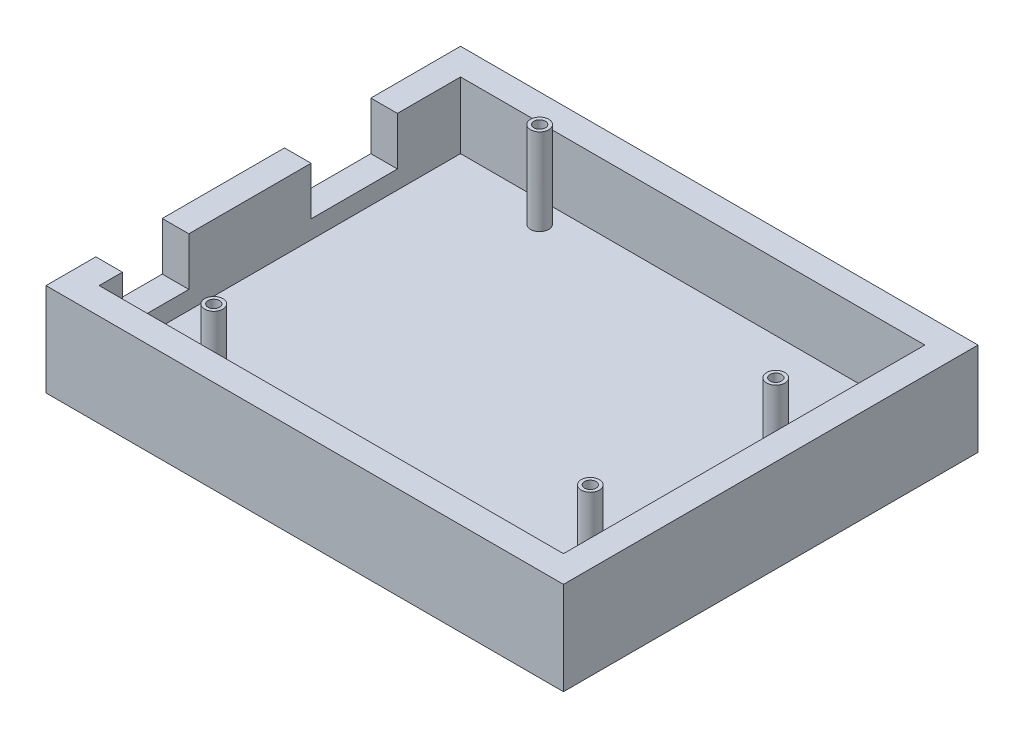
ISO-10303-21;
HEADER;
FILE_DESCRIPTION(('STEP AP214'),'2;1');
FILE_NAME('part.step','',(''),(''),'','','');
FILE_SCHEMA(('AUTOMOTIVE_DESIGN { 1 0 10303 214 1 1 1 1 }'));
ENDSEC;
DATA;
#1=APPLICATION_CONTEXT('core data for automotive mechanical design processes');
#2=APPLICATION_PROTOCOL_DEFINITION('international standard','automotive_design',2000,#1);
#3=PRODUCT_CONTEXT('',#1,'mechanical');
#4=PRODUCT('Part','Part','',(#3));
#5=PRODUCT_RELATED_PRODUCT_CATEGORY('part','',(#4));
#6=PRODUCT_DEFINITION_FORMATION('','',#4);
#7=PRODUCT_DEFINITION_CONTEXT('part definition',#1,'design');
#8=PRODUCT_DEFINITION('design','',#6,#7);
#9=PRODUCT_DEFINITION_SHAPE('','',#8);
#10=(LENGTH_UNIT() NAMED_UNIT(*) SI_UNIT(.MILLI.,.METRE.));
#11=(NAMED_UNIT(*) PLANE_ANGLE_UNIT() SI_UNIT($,.RADIAN.));
#12=(NAMED_UNIT(*) SI_UNIT($,.STERADIAN.) SOLID_ANGLE_UNIT());
#13=UNCERTAINTY_MEASURE_WITH_UNIT(LENGTH_MEASURE(1.E-05),#10,'distance_accuracy_value','');
#14=(GEOMETRIC_REPRESENTATION_CONTEXT(3) GLOBAL_UNCERTAINTY_ASSIGNED_CONTEXT((#13)) GLOBAL_UNIT_ASSIGNED_CONTEXT((#10,
#11,#12)) REPRESENTATION_CONTEXT('',''));
#15=CARTESIAN_POINT('',(0.,0.,0.));
#16=DIRECTION('',(0.,0.,1.));
#17=DIRECTION('',(1.,0.,0.));
#18=AXIS2_PLACEMENT_3D('',#15,#16,#17);
#19=CARTESIAN_POINT('',(0.,10.,0.));
#20=DIRECTION('',(0.,1.,0.));
#21=DIRECTION('',(0.,0.,1.));
#22=AXIS2_PLACEMENT_3D('',#19,#20,#21);
#23=PLANE('',#22);
#24=DIRECTION('',(0.,0.,1.));
#25=VECTOR('',#24,1.);
#26=CARTESIAN_POINT('',(0.,10.,0.));
#27=LINE('',#26,#25);
#28=CARTESIAN_POINT('',(0.,10.,-3.5));
#29=VERTEX_POINT('',#28);
#30=CARTESIAN_POINT('',(0.,10.,0.));
#31=VERTEX_POINT('',#30);
#32=EDGE_CURVE('E179',#29,#31,#27,.T.);
#33=ORIENTED_EDGE('',*,*,#32,.F.);
#34=DIRECTION('',(-1.,0.,0.));
#35=VECTOR('',#34,1.);
#36=CARTESIAN_POINT('',(73.901,10.,-3.5));
#37=LINE('',#36,#35);
#38=CARTESIAN_POINT('',(-4.,10.,-3.5));
#39=VERTEX_POINT('',#38);
#40=EDGE_CURVE('E257',#29,#39,#37,.T.);
#41=ORIENTED_EDGE('',*,*,#40,.T.);
#42=DIRECTION('',(0.,0.,1.));
#43=VECTOR('',#42,1.);
#44=CARTESIAN_POINT('',(-4.,10.,4.));
#45=LINE('',#44,#43);
#46=CARTESIAN_POINT('',(-4.,10.,4.));
#47=VERTEX_POINT('',#46);
#48=EDGE_CURVE('E221',#39,#47,#45,.T.);
#49=ORIENTED_EDGE('',*,*,#48,.T.);
#50=DIRECTION('',(1.,0.,0.));
#51=VECTOR('',#50,1.);
#52=CARTESIAN_POINT('',(-4.,10.,4.));
#53=LINE('',#52,#51);
#54=CARTESIAN_POINT('',(73.9,10.,4.));
#55=VERTEX_POINT('',#54);
#56=EDGE_CURVE('E214',#47,#55,#53,.T.);
#57=ORIENTED_EDGE('',*,*,#56,.T.);
#58=DIRECTION('',(0.,0.,-1.));
#59=VECTOR('',#58,1.);
#60=CARTESIAN_POINT('',(73.9,10.,4.));
#61=LINE('',#60,#59);
#62=CARTESIAN_POINT('',(73.9,10.,-58.4));
#63=VERTEX_POINT('',#62);
#64=EDGE_CURVE('E217',#55,#63,#61,.T.);
#65=ORIENTED_EDGE('',*,*,#64,.T.);
#66=DIRECTION('',(-1.,0.,0.));
#67=VECTOR('',#66,1.);
#68=CARTESIAN_POINT('',(-4.,10.,-58.4));
#69=LINE('',#68,#67);
#70=CARTESIAN_POINT('',(-4.,10.,-58.4));
#71=VERTEX_POINT('',#70);
#72=EDGE_CURVE('E219',#63,#71,#69,.T.);
#73=ORIENTED_EDGE('',*,*,#72,.T.);
#74=CARTESIAN_POINT('',(-4.,10.,-44.9));
#75=VERTEX_POINT('',#74);
#76=EDGE_CURVE('E222',#71,#75,#45,.T.);
#77=ORIENTED_EDGE('',*,*,#76,.T.);
#78=DIRECTION('',(-1.,0.,0.));
#79=VECTOR('',#78,1.);
#80=CARTESIAN_POINT('',(73.901,10.,-44.9));
#81=LINE('',#80,#79);
#82=CARTESIAN_POINT('',(0.,10.,-44.9));
#83=VERTEX_POINT('',#82);
#84=EDGE_CURVE('E265',#83,#75,#81,.T.);
#85=ORIENTED_EDGE('',*,*,#84,.F.);
#86=CARTESIAN_POINT('',(0.,10.,-54.4));
#87=VERTEX_POINT('',#86);
#88=EDGE_CURVE('E178',#87,#83,#27,.T.);
#89=ORIENTED_EDGE('',*,*,#88,.F.);
#90=DIRECTION('',(-1.,0.,0.));
#91=VECTOR('',#90,1.);
#92=CARTESIAN_POINT('',(0.,10.,-54.4));
#93=LINE('',#92,#91);
#94=CARTESIAN_POINT('',(69.9,10.,-54.4));
#95=VERTEX_POINT('',#94);
#96=EDGE_CURVE('E192',#95,#87,#93,.T.);
#97=ORIENTED_EDGE('',*,*,#96,.F.);
#98=DIRECTION('',(0.,0.,-1.));
#99=VECTOR('',#98,1.);
#100=CARTESIAN_POINT('',(69.9,10.,0.));
#101=LINE('',#100,#99);
#102=CARTESIAN_POINT('',(69.9,10.,0.));
#103=VERTEX_POINT('',#102);
#104=EDGE_CURVE('E189',#103,#95,#101,.T.);
#105=ORIENTED_EDGE('',*,*,#104,.F.);
#106=DIRECTION('',(1.,0.,0.));
#107=VECTOR('',#106,1.);
#108=CARTESIAN_POINT('',(0.,10.,0.));
#109=LINE('',#108,#107);
#110=EDGE_CURVE('E182',#31,#103,#109,.T.);
#111=ORIENTED_EDGE('',*,*,#110,.F.);
#112=EDGE_LOOP('',(#33,#41,#49,#57,#65,#73,#77,#85,#89,#97,#105,#111));
#113=FACE_BOUND('',#112,.T.);
#114=ADVANCED_FACE('F41',(#113),#23,.T.);
#115=CARTESIAN_POINT('',(-4.,10.,-31.9));
#116=VERTEX_POINT('',#115);
#117=CARTESIAN_POINT('',(-4.,10.,-13.5));
#118=VERTEX_POINT('',#117);
#119=EDGE_CURVE('E171',#116,#118,#45,.T.);
#120=ORIENTED_EDGE('',*,*,#119,.T.);
#121=DIRECTION('',(-1.,0.,0.));
#122=VECTOR('',#121,1.);
#123=CARTESIAN_POINT('',(73.901,10.,-13.5));
#124=LINE('',#123,#122);
#125=CARTESIAN_POINT('',(0.,10.,-13.5));
#126=VERTEX_POINT('',#125);
#127=EDGE_CURVE('E157',#126,#118,#124,.T.);
#128=ORIENTED_EDGE('',*,*,#127,.F.);
#129=CARTESIAN_POINT('',(0.,10.,-31.9));
#130=VERTEX_POINT('',#129);
#131=EDGE_CURVE('E169',#130,#126,#27,.T.);
#132=ORIENTED_EDGE('',*,*,#131,.F.);
#133=DIRECTION('',(-1.,0.,0.));
#134=VECTOR('',#133,1.);
#135=CARTESIAN_POINT('',(73.901,10.,-31.9));
#136=LINE('',#135,#134);
#137=EDGE_CURVE('E66',#130,#116,#136,.T.);
#138=ORIENTED_EDGE('',*,*,#137,.T.);
#139=EDGE_LOOP('',(#120,#128,#132,#138));
#140=FACE_BOUND('',#139,.T.);
#141=ADVANCED_FACE('F168',(#140),#23,.T.);
#142=CARTESIAN_POINT('',(-4.,10.,4.));
#143=DIRECTION('',(1.,0.,0.));
#144=DIRECTION('',(0.,0.,-1.));
#145=AXIS2_PLACEMENT_3D('',#142,#143,#144);
#146=PLANE('',#145);
#147=DIRECTION('',(0.,-1.,0.));
#148=VECTOR('',#147,1.);
#149=CARTESIAN_POINT('',(-4.,0.,-3.5));
#150=LINE('',#149,#148);
#151=CARTESIAN_POINT('',(-4.,2.75000000000003,-3.5));
#152=VERTEX_POINT('',#151);
#153=EDGE_CURVE('E254',#39,#152,#150,.T.);
#154=ORIENTED_EDGE('',*,*,#153,.T.);
#155=DIRECTION('',(0.,0.,-1.));
#156=VECTOR('',#155,1.);
#157=CARTESIAN_POINT('',(-4.,2.75000000000003,0.));
#158=LINE('',#157,#156);
#159=CARTESIAN_POINT('',(-4.,2.75000000000003,-13.5));
#160=VERTEX_POINT('',#159);
#161=EDGE_CURVE('E249',#152,#160,#158,.T.);
#162=ORIENTED_EDGE('',*,*,#161,.T.);
#163=DIRECTION('',(0.,1.,0.));
#164=VECTOR('',#163,1.);
#165=CARTESIAN_POINT('',(-4.,0.,-13.5));
#166=LINE('',#165,#164);
#167=EDGE_CURVE('E173',#160,#118,#166,.T.);
#168=ORIENTED_EDGE('',*,*,#167,.T.);
#169=ORIENTED_EDGE('',*,*,#119,.F.);
#170=DIRECTION('',(0.,1.,0.));
#171=VECTOR('',#170,1.);
#172=CARTESIAN_POINT('',(-4.,2.75000000000003,-31.9));
#173=LINE('',#172,#171);
#174=CARTESIAN_POINT('',(-4.,2.75000000000003,-31.9));
#175=VERTEX_POINT('',#174);
#176=EDGE_CURVE('E270',#175,#116,#173,.T.);
#177=ORIENTED_EDGE('',*,*,#176,.F.);
#178=DIRECTION('',(0.,0.,1.));
#179=VECTOR('',#178,1.);
#180=CARTESIAN_POINT('',(-4.,2.75000000000003,-44.9));
#181=LINE('',#180,#179);
#182=CARTESIAN_POINT('',(-4.,2.75000000000003,-44.9));
#183=VERTEX_POINT('',#182);
#184=EDGE_CURVE('E272',#183,#175,#181,.T.);
#185=ORIENTED_EDGE('',*,*,#184,.F.);
#186=DIRECTION('',(0.,-1.,0.));
#187=VECTOR('',#186,1.);
#188=CARTESIAN_POINT('',(-4.,2.75000000000003,-44.9));
#189=LINE('',#188,#187);
#190=EDGE_CURVE('E266',#75,#183,#189,.T.);
#191=ORIENTED_EDGE('',*,*,#190,.F.);
#192=ORIENTED_EDGE('',*,*,#76,.F.);
#193=DIRECTION('',(0.,-1.,0.));
#194=VECTOR('',#193,1.);
#195=CARTESIAN_POINT('',(-4.,10.,-58.4));
#196=LINE('',#195,#194);
#197=CARTESIAN_POINT('',(-4.,-3.99999999999997,-58.4));
#198=VERTEX_POINT('',#197);
#199=EDGE_CURVE('E227',#71,#198,#196,.T.);
#200=ORIENTED_EDGE('',*,*,#199,.T.);
#201=DIRECTION('',(0.,0.,1.));
#202=VECTOR('',#201,1.);
#203=CARTESIAN_POINT('',(-4.,-3.99999999999997,-58.4));
#204=LINE('',#203,#202);
#205=CARTESIAN_POINT('',(-4.,-3.99999999999997,4.));
#206=VERTEX_POINT('',#205);
#207=EDGE_CURVE('E286',#198,#206,#204,.T.);
#208=ORIENTED_EDGE('',*,*,#207,.T.);
#209=DIRECTION('',(0.,-1.,0.));
#210=VECTOR('',#209,1.);
#211=CARTESIAN_POINT('',(-4.,10.,4.));
#212=LINE('',#211,#210);
#213=EDGE_CURVE('E225',#47,#206,#212,.T.);
#214=ORIENTED_EDGE('',*,*,#213,.F.);
#215=ORIENTED_EDGE('',*,*,#48,.F.);
#216=EDGE_LOOP('',(#154,#162,#168,#169,#177,#185,#191,#192,#200,#208,#214,#215));
#217=FACE_BOUND('',#216,.T.);
#218=ADVANCED_FACE('F301',(#217),#146,.F.);
#219=CARTESIAN_POINT('',(0.,10.,0.));
#220=DIRECTION('',(1.,0.,0.));
#221=DIRECTION('',(0.,0.,-1.));
#222=AXIS2_PLACEMENT_3D('',#219,#220,#221);
#223=PLANE('',#222);
#224=DIRECTION('',(0.,0.,-1.));
#225=VECTOR('',#224,1.);
#226=CARTESIAN_POINT('',(0.,2.75000000000003,0.));
#227=LINE('',#226,#225);
#228=CARTESIAN_POINT('',(0.,2.75000000000003,-3.5));
#229=VERTEX_POINT('',#228);
#230=CARTESIAN_POINT('',(0.,2.75000000000003,-13.5));
#231=VERTEX_POINT('',#230);
#232=EDGE_CURVE('E163',#229,#231,#227,.T.);
#233=ORIENTED_EDGE('',*,*,#232,.F.);
#234=DIRECTION('',(0.,-1.,0.));
#235=VECTOR('',#234,1.);
#236=CARTESIAN_POINT('',(0.,0.,-3.5));
#237=LINE('',#236,#235);
#238=EDGE_CURVE('E172',#29,#229,#237,.T.);
#239=ORIENTED_EDGE('',*,*,#238,.F.);
#240=ORIENTED_EDGE('',*,*,#32,.T.);
#241=DIRECTION('',(0.,-1.,0.));
#242=VECTOR('',#241,1.);
#243=CARTESIAN_POINT('',(0.,10.,0.));
#244=LINE('',#243,#242);
#245=CARTESIAN_POINT('',(0.,0.,0.));
#246=VERTEX_POINT('',#245);
#247=EDGE_CURVE('E211',#31,#246,#244,.T.);
#248=ORIENTED_EDGE('',*,*,#247,.T.);
#249=DIRECTION('',(0.,0.,1.));
#250=VECTOR('',#249,1.);
#251=CARTESIAN_POINT('',(0.,0.,0.));
#252=LINE('',#251,#250);
#253=CARTESIAN_POINT('',(0.,0.,-54.4));
#254=VERTEX_POINT('',#253);
#255=EDGE_CURVE('E195',#254,#246,#252,.T.);
#256=ORIENTED_EDGE('',*,*,#255,.F.);
#257=DIRECTION('',(0.,-1.,0.));
#258=VECTOR('',#257,1.);
#259=CARTESIAN_POINT('',(0.,10.,-54.4));
#260=LINE('',#259,#258);
#261=EDGE_CURVE('E194',#87,#254,#260,.T.);
#262=ORIENTED_EDGE('',*,*,#261,.F.);
#263=ORIENTED_EDGE('',*,*,#88,.T.);
#264=DIRECTION('',(0.,-1.,0.));
#265=VECTOR('',#264,1.);
#266=CARTESIAN_POINT('',(0.,2.75000000000003,-44.9));
#267=LINE('',#266,#265);
#268=CARTESIAN_POINT('',(0.,2.75000000000003,-44.9));
#269=VERTEX_POINT('',#268);
#270=EDGE_CURVE('E275',#83,#269,#267,.T.);
#271=ORIENTED_EDGE('',*,*,#270,.T.);
#272=DIRECTION('',(0.,0.,1.));
#273=VECTOR('',#272,1.);
#274=CARTESIAN_POINT('',(0.,2.75000000000003,-44.9));
#275=LINE('',#274,#273);
#276=CARTESIAN_POINT('',(0.,2.75000000000003,-31.9));
#277=VERTEX_POINT('',#276);
#278=EDGE_CURVE('E162',#269,#277,#275,.T.);
#279=ORIENTED_EDGE('',*,*,#278,.T.);
#280=DIRECTION('',(0.,1.,0.));
#281=VECTOR('',#280,1.);
#282=CARTESIAN_POINT('',(0.,2.75000000000003,-31.9));
#283=LINE('',#282,#281);
#284=EDGE_CURVE('E177',#277,#130,#283,.T.);
#285=ORIENTED_EDGE('',*,*,#284,.T.);
#286=ORIENTED_EDGE('',*,*,#131,.T.);
#287=DIRECTION('',(0.,1.,0.));
#288=VECTOR('',#287,1.);
#289=CARTESIAN_POINT('',(0.,0.,-13.5));
#290=LINE('',#289,#288);
#291=EDGE_CURVE('E154',#231,#126,#290,.T.);
#292=ORIENTED_EDGE('',*,*,#291,.F.);
#293=EDGE_LOOP('',(#233,#239,#240,#248,#256,#262,#263,#271,#279,#285,#286,#292));
#294=FACE_BOUND('',#293,.T.);
#295=ADVANCED_FACE('F175',(#294),#223,.T.);
#296=CARTESIAN_POINT('',(-4.,10.,4.));
#297=DIRECTION('',(0.,0.,-1.));
#298=DIRECTION('',(-1.,0.,0.));
#299=AXIS2_PLACEMENT_3D('',#296,#297,#298);
#300=PLANE('',#299);
#301=ORIENTED_EDGE('',*,*,#213,.T.);
#302=DIRECTION('',(1.,0.,0.));
#303=VECTOR('',#302,1.);
#304=CARTESIAN_POINT('',(-4.,-3.99999999999997,4.));
#305=LINE('',#304,#303);
#306=CARTESIAN_POINT('',(73.9,-3.99999999999997,4.));
#307=VERTEX_POINT('',#306);
#308=EDGE_CURVE('E288',#206,#307,#305,.T.);
#309=ORIENTED_EDGE('',*,*,#308,.T.);
#310=DIRECTION('',(0.,-1.,0.));
#311=VECTOR('',#310,1.);
#312=CARTESIAN_POINT('',(73.9,10.,4.));
#313=LINE('',#312,#311);
#314=EDGE_CURVE('E45',#55,#307,#313,.T.);
#315=ORIENTED_EDGE('',*,*,#314,.F.);
#316=ORIENTED_EDGE('',*,*,#56,.F.);
#317=EDGE_LOOP('',(#301,#309,#315,#316));
#318=FACE_BOUND('',#317,.T.);
#319=ADVANCED_FACE('F43',(#318),#300,.F.);
#320=CARTESIAN_POINT('',(73.9,10.,4.));
#321=DIRECTION('',(-1.,0.,0.));
#322=DIRECTION('',(0.,0.,1.));
#323=AXIS2_PLACEMENT_3D('',#320,#321,#322);
#324=PLANE('',#323);
#325=ORIENTED_EDGE('',*,*,#314,.T.);
#326=DIRECTION('',(0.,0.,-1.));
#327=VECTOR('',#326,1.);
#328=CARTESIAN_POINT('',(73.9,-3.99999999999997,4.));
#329=LINE('',#328,#327);
#330=CARTESIAN_POINT('',(73.9,-3.99999999999997,-58.4));
#331=VERTEX_POINT('',#330);
#332=EDGE_CURVE('E186',#307,#331,#329,.T.);
#333=ORIENTED_EDGE('',*,*,#332,.T.);
#334=DIRECTION('',(0.,-1.,0.));
#335=VECTOR('',#334,1.);
#336=CARTESIAN_POINT('',(73.9,10.,-58.4));
#337=LINE('',#336,#335);
#338=EDGE_CURVE('E228',#63,#331,#337,.T.);
#339=ORIENTED_EDGE('',*,*,#338,.F.);
#340=ORIENTED_EDGE('',*,*,#64,.F.);
#341=EDGE_LOOP('',(#325,#333,#339,#340));
#342=FACE_BOUND('',#341,.T.);
#343=ADVANCED_FACE('F292',(#342),#324,.F.);
#344=CARTESIAN_POINT('',(-4.,10.,-58.4));
#345=DIRECTION('',(0.,0.,1.));
#346=DIRECTION('',(1.,0.,0.));
#347=AXIS2_PLACEMENT_3D('',#344,#345,#346);
#348=PLANE('',#347);
#349=ORIENTED_EDGE('',*,*,#338,.T.);
#350=DIRECTION('',(-1.,0.,0.));
#351=VECTOR('',#350,1.);
#352=CARTESIAN_POINT('',(73.9,-3.99999999999997,-58.4));
#353=LINE('',#352,#351);
#354=EDGE_CURVE('E269',#331,#198,#353,.T.);
#355=ORIENTED_EDGE('',*,*,#354,.T.);
#356=ORIENTED_EDGE('',*,*,#199,.F.);
#357=ORIENTED_EDGE('',*,*,#72,.F.);
#358=EDGE_LOOP('',(#349,#355,#356,#357));
#359=FACE_BOUND('',#358,.T.);
#360=ADVANCED_FACE('F297',(#359),#348,.F.);
#361=CARTESIAN_POINT('',(0.,10.,0.));
#362=DIRECTION('',(0.,0.,-1.));
#363=DIRECTION('',(-1.,0.,0.));
#364=AXIS2_PLACEMENT_3D('',#361,#362,#363);
#365=PLANE('',#364);
#366=DIRECTION('',(1.,0.,0.));
#367=VECTOR('',#366,1.);
#368=CARTESIAN_POINT('',(0.,0.,0.));
#369=LINE('',#368,#367);
#370=CARTESIAN_POINT('',(69.9,0.,0.));
#371=VERTEX_POINT('',#370);
#372=EDGE_CURVE('E198',#246,#371,#369,.T.);
#373=ORIENTED_EDGE('',*,*,#372,.F.);
#374=ORIENTED_EDGE('',*,*,#247,.F.);
#375=ORIENTED_EDGE('',*,*,#110,.T.);
#376=DIRECTION('',(0.,-1.,0.));
#377=VECTOR('',#376,1.);
#378=CARTESIAN_POINT('',(69.9,10.,0.));
#379=LINE('',#378,#377);
#380=EDGE_CURVE('E209',#103,#371,#379,.T.);
#381=ORIENTED_EDGE('',*,*,#380,.T.);
#382=EDGE_LOOP('',(#373,#374,#375,#381));
#383=FACE_BOUND('',#382,.T.);
#384=ADVANCED_FACE('F327',(#383),#365,.T.);
#385=CARTESIAN_POINT('',(69.9,10.,0.));
#386=DIRECTION('',(-1.,0.,0.));
#387=DIRECTION('',(0.,0.,1.));
#388=AXIS2_PLACEMENT_3D('',#385,#386,#387);
#389=PLANE('',#388);
#390=DIRECTION('',(0.,0.,-1.));
#391=VECTOR('',#390,1.);
#392=CARTESIAN_POINT('',(69.9,0.,0.));
#393=LINE('',#392,#391);
#394=CARTESIAN_POINT('',(69.9,0.,-54.4));
#395=VERTEX_POINT('',#394);
#396=EDGE_CURVE('E201',#371,#395,#393,.T.);
#397=ORIENTED_EDGE('',*,*,#396,.F.);
#398=ORIENTED_EDGE('',*,*,#380,.F.);
#399=ORIENTED_EDGE('',*,*,#104,.T.);
#400=DIRECTION('',(0.,-1.,0.));
#401=VECTOR('',#400,1.);
#402=CARTESIAN_POINT('',(69.9,10.,-54.4));
#403=LINE('',#402,#401);
#404=EDGE_CURVE('E207',#95,#395,#403,.T.);
#405=ORIENTED_EDGE('',*,*,#404,.T.);
#406=EDGE_LOOP('',(#397,#398,#399,#405));
#407=FACE_BOUND('',#406,.T.);
#408=ADVANCED_FACE('F331',(#407),#389,.T.);
#409=CARTESIAN_POINT('',(0.,10.,-54.4));
#410=DIRECTION('',(0.,0.,1.));
#411=DIRECTION('',(1.,0.,0.));
#412=AXIS2_PLACEMENT_3D('',#409,#410,#411);
#413=PLANE('',#412);
#414=DIRECTION('',(-1.,0.,0.));
#415=VECTOR('',#414,1.);
#416=CARTESIAN_POINT('',(0.,0.,-54.4));
#417=LINE('',#416,#415);
#418=EDGE_CURVE('E183',#395,#254,#417,.T.);
#419=ORIENTED_EDGE('',*,*,#418,.F.);
#420=ORIENTED_EDGE('',*,*,#404,.F.);
#421=ORIENTED_EDGE('',*,*,#96,.T.);
#422=ORIENTED_EDGE('',*,*,#261,.T.);
#423=EDGE_LOOP('',(#419,#420,#421,#422));
#424=FACE_BOUND('',#423,.T.);
#425=ADVANCED_FACE('F336',(#424),#413,.T.);
#426=CARTESIAN_POINT('',(0.,0.,0.));
#427=DIRECTION('',(0.,1.,0.));
#428=DIRECTION('',(0.,0.,1.));
#429=AXIS2_PLACEMENT_3D('',#426,#427,#428);
#430=PLANE('',#429);
#431=CARTESIAN_POINT('',(14.01445,0.,-3.24144999999999));
#432=DIRECTION('',(0.,1.,0.));
#433=DIRECTION('',(0.,0.,1.));
#434=AXIS2_PLACEMENT_3D('',#431,#432,#433);
#435=CIRCLE('',#434,1.36925);
#436=CARTESIAN_POINT('',(14.01445,0.,-1.87219999999999));
#437=VERTEX_POINT('',#436);
#438=EDGE_CURVE('E11',#437,#437,#435,.T.);
#439=ORIENTED_EDGE('',*,*,#438,.F.);
#440=EDGE_LOOP('',(#439));
#441=FACE_BOUND('',#440,.T.);
#442=CARTESIAN_POINT('',(65.94475,0.,-35.91855));
#443=DIRECTION('',(0.,1.,0.));
#444=DIRECTION('',(0.,0.,1.));
#445=AXIS2_PLACEMENT_3D('',#442,#443,#444);
#446=CIRCLE('',#445,1.36925);
#447=CARTESIAN_POINT('',(65.94475,0.,-34.5493));
#448=VERTEX_POINT('',#447);
#449=EDGE_CURVE('E50',#448,#448,#446,.T.);
#450=ORIENTED_EDGE('',*,*,#449,.F.);
#451=EDGE_LOOP('',(#450));
#452=FACE_BOUND('',#451,.T.);
#453=CARTESIAN_POINT('',(15.15745,0.,-51.15855));
#454=DIRECTION('',(0.,1.,0.));
#455=DIRECTION('',(0.,0.,1.));
#456=AXIS2_PLACEMENT_3D('',#453,#454,#455);
#457=CIRCLE('',#456,1.36924999999999);
#458=CARTESIAN_POINT('',(15.15745,0.,-49.7893));
#459=VERTEX_POINT('',#458);
#460=EDGE_CURVE('E240',#459,#459,#457,.T.);
#461=ORIENTED_EDGE('',*,*,#460,.F.);
#462=EDGE_LOOP('',(#461));
#463=FACE_BOUND('',#462,.T.);
#464=CARTESIAN_POINT('',(65.94475,0.,-7.99125000000001));
#465=DIRECTION('',(0.,1.,0.));
#466=DIRECTION('',(0.,0.,1.));
#467=AXIS2_PLACEMENT_3D('',#464,#465,#466);
#468=CIRCLE('',#467,1.36925);
#469=CARTESIAN_POINT('',(65.94475,0.,-6.62200000000001));
#470=VERTEX_POINT('',#469);
#471=EDGE_CURVE('E234',#470,#470,#468,.T.);
#472=ORIENTED_EDGE('',*,*,#471,.F.);
#473=EDGE_LOOP('',(#472));
#474=FACE_BOUND('',#473,.T.);
#475=ORIENTED_EDGE('',*,*,#418,.T.);
#476=ORIENTED_EDGE('',*,*,#255,.T.);
#477=ORIENTED_EDGE('',*,*,#372,.T.);
#478=ORIENTED_EDGE('',*,*,#396,.T.);
#479=EDGE_LOOP('',(#475,#476,#477,#478));
#480=FACE_BOUND('',#479,.T.);
#481=ADVANCED_FACE('F342',(#441,#452,#463,#474,#480),#430,.T.);
#482=CARTESIAN_POINT('',(0.,-3.99999999999997,0.));
#483=DIRECTION('',(0.,1.,0.));
#484=DIRECTION('',(0.,0.,1.));
#485=AXIS2_PLACEMENT_3D('',#482,#483,#484);
#486=PLANE('',#485);
#487=ORIENTED_EDGE('',*,*,#354,.F.);
#488=ORIENTED_EDGE('',*,*,#332,.F.);
#489=ORIENTED_EDGE('',*,*,#308,.F.);
#490=ORIENTED_EDGE('',*,*,#207,.F.);
#491=EDGE_LOOP('',(#487,#488,#489,#490));
#492=FACE_BOUND('',#491,.T.);
#493=ADVANCED_FACE('F294',(#492),#486,.F.);
#494=CARTESIAN_POINT('',(73.901,2.75000000000003,-44.9));
#495=DIRECTION('',(0.,-1.,0.));
#496=DIRECTION('',(0.,0.,-1.));
#497=AXIS2_PLACEMENT_3D('',#494,#495,#496);
#498=PLANE('',#497);
#499=DIRECTION('',(-1.,0.,0.));
#500=VECTOR('',#499,1.);
#501=CARTESIAN_POINT('',(73.901,2.75000000000003,-44.9));
#502=LINE('',#501,#500);
#503=EDGE_CURVE('E278',#269,#183,#502,.T.);
#504=ORIENTED_EDGE('',*,*,#503,.T.);
#505=ORIENTED_EDGE('',*,*,#184,.T.);
#506=DIRECTION('',(-1.,0.,0.));
#507=VECTOR('',#506,1.);
#508=CARTESIAN_POINT('',(73.901,2.75000000000003,-31.9));
#509=LINE('',#508,#507);
#510=EDGE_CURVE('E279',#277,#175,#509,.T.);
#511=ORIENTED_EDGE('',*,*,#510,.F.);
#512=ORIENTED_EDGE('',*,*,#278,.F.);
#513=EDGE_LOOP('',(#504,#505,#511,#512));
#514=FACE_BOUND('',#513,.T.);
#515=ADVANCED_FACE('F349',(#514),#498,.F.);
#516=CARTESIAN_POINT('',(73.901,2.75000000000003,-44.9));
#517=DIRECTION('',(0.,0.,-1.));
#518=DIRECTION('',(-1.,0.,0.));
#519=AXIS2_PLACEMENT_3D('',#516,#517,#518);
#520=PLANE('',#519);
#521=ORIENTED_EDGE('',*,*,#84,.T.);
#522=ORIENTED_EDGE('',*,*,#190,.T.);
#523=ORIENTED_EDGE('',*,*,#503,.F.);
#524=ORIENTED_EDGE('',*,*,#270,.F.);
#525=EDGE_LOOP('',(#521,#522,#523,#524));
#526=FACE_BOUND('',#525,.T.);
#527=ADVANCED_FACE('F352',(#526),#520,.F.);
#528=CARTESIAN_POINT('',(73.901,2.75000000000003,-31.9));
#529=DIRECTION('',(0.,0.,1.));
#530=DIRECTION('',(1.,0.,0.));
#531=AXIS2_PLACEMENT_3D('',#528,#529,#530);
#532=PLANE('',#531);
#533=ORIENTED_EDGE('',*,*,#510,.T.);
#534=ORIENTED_EDGE('',*,*,#176,.T.);
#535=ORIENTED_EDGE('',*,*,#137,.F.);
#536=ORIENTED_EDGE('',*,*,#284,.F.);
#537=EDGE_LOOP('',(#533,#534,#535,#536));
#538=FACE_BOUND('',#537,.T.);
#539=ADVANCED_FACE('F356',(#538),#532,.F.);
#540=CARTESIAN_POINT('',(73.901,0.,-3.5));
#541=DIRECTION('',(0.,0.,-1.));
#542=DIRECTION('',(0.,1.,0.));
#543=AXIS2_PLACEMENT_3D('',#540,#541,#542);
#544=PLANE('',#543);
#545=ORIENTED_EDGE('',*,*,#238,.T.);
#546=DIRECTION('',(-1.,0.,0.));
#547=VECTOR('',#546,1.);
#548=CARTESIAN_POINT('',(73.901,2.75000000000003,-3.5));
#549=LINE('',#548,#547);
#550=EDGE_CURVE('E252',#229,#152,#549,.T.);
#551=ORIENTED_EDGE('',*,*,#550,.T.);
#552=ORIENTED_EDGE('',*,*,#153,.F.);
#553=ORIENTED_EDGE('',*,*,#40,.F.);
#554=EDGE_LOOP('',(#545,#551,#552,#553));
#555=FACE_BOUND('',#554,.T.);
#556=ADVANCED_FACE('F359',(#555),#544,.T.);
#557=CARTESIAN_POINT('',(73.901,2.75000000000003,0.));
#558=DIRECTION('',(0.,1.,0.));
#559=DIRECTION('',(0.,0.,1.));
#560=AXIS2_PLACEMENT_3D('',#557,#558,#559);
#561=PLANE('',#560);
#562=ORIENTED_EDGE('',*,*,#232,.T.);
#563=DIRECTION('',(-1.,0.,0.));
#564=VECTOR('',#563,1.);
#565=CARTESIAN_POINT('',(73.901,2.75000000000003,-13.5));
#566=LINE('',#565,#564);
#567=EDGE_CURVE('E58',#231,#160,#566,.T.);
#568=ORIENTED_EDGE('',*,*,#567,.T.);
#569=ORIENTED_EDGE('',*,*,#161,.F.);
#570=ORIENTED_EDGE('',*,*,#550,.F.);
#571=EDGE_LOOP('',(#562,#568,#569,#570));
#572=FACE_BOUND('',#571,.T.);
#573=ADVANCED_FACE('F362',(#572),#561,.T.);
#574=CARTESIAN_POINT('',(73.901,0.,-13.5));
#575=DIRECTION('',(0.,0.,1.));
#576=DIRECTION('',(0.,-1.,0.));
#577=AXIS2_PLACEMENT_3D('',#574,#575,#576);
#578=PLANE('',#577);
#579=ORIENTED_EDGE('',*,*,#291,.T.);
#580=ORIENTED_EDGE('',*,*,#127,.T.);
#581=ORIENTED_EDGE('',*,*,#167,.F.);
#582=ORIENTED_EDGE('',*,*,#567,.F.);
#583=EDGE_LOOP('',(#579,#580,#581,#582));
#584=FACE_BOUND('',#583,.T.);
#585=ADVANCED_FACE('F156',(#584),#578,.T.);
#586=CARTESIAN_POINT('',(65.94475,13.,-7.99125000000001));
#587=DIRECTION('',(0.,-1.,0.));
#588=DIRECTION('',(0.,0.,-1.));
#589=AXIS2_PLACEMENT_3D('',#586,#587,#588);
#590=CYLINDRICAL_SURFACE('',#589,1.36925);
#591=ORIENTED_EDGE('',*,*,#471,.T.);
#592=EDGE_LOOP('',(#591));
#593=FACE_BOUND('',#592,.T.);
#594=CARTESIAN_POINT('',(65.94475,13.,-7.99125000000001));
#595=DIRECTION('',(0.,-1.,0.));
#596=DIRECTION('',(0.,0.,-1.));
#597=AXIS2_PLACEMENT_3D('',#594,#595,#596);
#598=CIRCLE('',#597,1.36925);
#599=CARTESIAN_POINT('',(65.94475,13.,-9.36050000000001));
#600=VERTEX_POINT('',#599);
#601=EDGE_CURVE('E248',#600,#600,#598,.T.);
#602=ORIENTED_EDGE('',*,*,#601,.T.);
#603=EDGE_LOOP('',(#602));
#604=FACE_BOUND('',#603,.T.);
#605=ADVANCED_FACE('F369',(#593,#604),#590,.T.);
#606=CARTESIAN_POINT('',(65.94475,13.,-7.99125000000001));
#607=DIRECTION('',(0.,-1.,0.));
#608=DIRECTION('',(0.,0.,-1.));
#609=AXIS2_PLACEMENT_3D('',#606,#607,#608);
#610=PLANE('',#609);
#611=CARTESIAN_POINT('',(65.94475,13.,-7.99125000000001));
#612=DIRECTION('',(0.,1.,0.));
#613=DIRECTION('',(0.,0.,1.));
#614=AXIS2_PLACEMENT_3D('',#611,#612,#613);
#615=CIRCLE('',#614,0.869250000000002);
#616=CARTESIAN_POINT('',(65.94475,13.,-7.12200000000001));
#617=VERTEX_POINT('',#616);
#618=EDGE_CURVE('E446',#617,#617,#615,.T.);
#619=ORIENTED_EDGE('',*,*,#618,.F.);
#620=EDGE_LOOP('',(#619));
#621=FACE_BOUND('',#620,.T.);
#622=ORIENTED_EDGE('',*,*,#601,.F.);
#623=EDGE_LOOP('',(#622));
#624=FACE_BOUND('',#623,.T.);
#625=ADVANCED_FACE('F372',(#621,#624),#610,.F.);
#626=CARTESIAN_POINT('',(15.15745,13.,-51.15855));
#627=DIRECTION('',(0.,-1.,0.));
#628=DIRECTION('',(0.,0.,-1.));
#629=AXIS2_PLACEMENT_3D('',#626,#627,#628);
#630=CYLINDRICAL_SURFACE('',#629,1.36924999999999);
#631=ORIENTED_EDGE('',*,*,#460,.T.);
#632=EDGE_LOOP('',(#631));
#633=FACE_BOUND('',#632,.T.);
#634=CARTESIAN_POINT('',(15.15745,13.,-51.15855));
#635=DIRECTION('',(0.,-1.,0.));
#636=DIRECTION('',(0.,0.,-1.));
#637=AXIS2_PLACEMENT_3D('',#634,#635,#636);
#638=CIRCLE('',#637,1.36924999999999);
#639=CARTESIAN_POINT('',(15.15745,13.,-52.5278));
#640=VERTEX_POINT('',#639);
#641=EDGE_CURVE('E465',#640,#640,#638,.T.);
#642=ORIENTED_EDGE('',*,*,#641,.T.);
#643=EDGE_LOOP('',(#642));
#644=FACE_BOUND('',#643,.T.);
#645=ADVANCED_FACE('F375',(#633,#644),#630,.T.);
#646=CARTESIAN_POINT('',(15.15745,13.,-51.15855));
#647=DIRECTION('',(0.,-1.,0.));
#648=DIRECTION('',(0.,0.,-1.));
#649=AXIS2_PLACEMENT_3D('',#646,#647,#648);
#650=PLANE('',#649);
#651=CARTESIAN_POINT('',(15.15745,13.,-51.15855));
#652=DIRECTION('',(0.,1.,0.));
#653=DIRECTION('',(0.,0.,1.));
#654=AXIS2_PLACEMENT_3D('',#651,#652,#653);
#655=CIRCLE('',#654,0.869249999999995);
#656=CARTESIAN_POINT('',(15.15745,13.,-50.2893));
#657=VERTEX_POINT('',#656);
#658=EDGE_CURVE('E437',#657,#657,#655,.T.);
#659=ORIENTED_EDGE('',*,*,#658,.F.);
#660=EDGE_LOOP('',(#659));
#661=FACE_BOUND('',#660,.T.);
#662=ORIENTED_EDGE('',*,*,#641,.F.);
#663=EDGE_LOOP('',(#662));
#664=FACE_BOUND('',#663,.T.);
#665=ADVANCED_FACE('F379',(#661,#664),#650,.F.);
#666=CARTESIAN_POINT('',(65.94475,13.,-35.91855));
#667=DIRECTION('',(0.,-1.,0.));
#668=DIRECTION('',(0.,0.,-1.));
#669=AXIS2_PLACEMENT_3D('',#666,#667,#668);
#670=CYLINDRICAL_SURFACE('',#669,1.36925);
#671=ORIENTED_EDGE('',*,*,#449,.T.);
#672=EDGE_LOOP('',(#671));
#673=FACE_BOUND('',#672,.T.);
#674=CARTESIAN_POINT('',(65.94475,13.,-35.91855));
#675=DIRECTION('',(0.,-1.,0.));
#676=DIRECTION('',(0.,0.,-1.));
#677=AXIS2_PLACEMENT_3D('',#674,#675,#676);
#678=CIRCLE('',#677,1.36925);
#679=CARTESIAN_POINT('',(65.94475,13.,-37.2878));
#680=VERTEX_POINT('',#679);
#681=EDGE_CURVE('E461',#680,#680,#678,.T.);
#682=ORIENTED_EDGE('',*,*,#681,.T.);
#683=EDGE_LOOP('',(#682));
#684=FACE_BOUND('',#683,.T.);
#685=ADVANCED_FACE('F383',(#673,#684),#670,.T.);
#686=CARTESIAN_POINT('',(65.94475,13.,-35.91855));
#687=DIRECTION('',(0.,-1.,0.));
#688=DIRECTION('',(0.,0.,-1.));
#689=AXIS2_PLACEMENT_3D('',#686,#687,#688);
#690=PLANE('',#689);
#691=CARTESIAN_POINT('',(65.94475,13.,-35.91855));
#692=DIRECTION('',(0.,1.,0.));
#693=DIRECTION('',(0.,0.,1.));
#694=AXIS2_PLACEMENT_3D('',#691,#692,#693);
#695=CIRCLE('',#694,0.869250000000002);
#696=CARTESIAN_POINT('',(65.94475,13.,-35.0493));
#697=VERTEX_POINT('',#696);
#698=EDGE_CURVE('E451',#697,#697,#695,.T.);
#699=ORIENTED_EDGE('',*,*,#698,.F.);
#700=EDGE_LOOP('',(#699));
#701=FACE_BOUND('',#700,.T.);
#702=ORIENTED_EDGE('',*,*,#681,.F.);
#703=EDGE_LOOP('',(#702));
#704=FACE_BOUND('',#703,.T.);
#705=ADVANCED_FACE('F387',(#701,#704),#690,.F.);
#706=CARTESIAN_POINT('',(14.01445,13.,-3.24144999999999));
#707=DIRECTION('',(0.,-1.,0.));
#708=DIRECTION('',(0.,0.,-1.));
#709=AXIS2_PLACEMENT_3D('',#706,#707,#708);
#710=CYLINDRICAL_SURFACE('',#709,1.36925);
#711=ORIENTED_EDGE('',*,*,#438,.T.);
#712=EDGE_LOOP('',(#711));
#713=FACE_BOUND('',#712,.T.);
#714=CARTESIAN_POINT('',(14.01445,13.,-3.24144999999999));
#715=DIRECTION('',(0.,-1.,0.));
#716=DIRECTION('',(0.,0.,-1.));
#717=AXIS2_PLACEMENT_3D('',#714,#715,#716);
#718=CIRCLE('',#717,1.36925);
#719=CARTESIAN_POINT('',(14.01445,13.,-4.61069999999999));
#720=VERTEX_POINT('',#719);
#721=EDGE_CURVE('E457',#720,#720,#718,.T.);
#722=ORIENTED_EDGE('',*,*,#721,.T.);
#723=EDGE_LOOP('',(#722));
#724=FACE_BOUND('',#723,.T.);
#725=ADVANCED_FACE('F391',(#713,#724),#710,.T.);
#726=CARTESIAN_POINT('',(14.01445,13.,-3.24144999999999));
#727=DIRECTION('',(0.,-1.,0.));
#728=DIRECTION('',(0.,0.,-1.));
#729=AXIS2_PLACEMENT_3D('',#726,#727,#728);
#730=PLANE('',#729);
#731=CARTESIAN_POINT('',(14.01445,13.,-3.24144999999999));
#732=DIRECTION('',(0.,1.,0.));
#733=DIRECTION('',(0.,0.,1.));
#734=AXIS2_PLACEMENT_3D('',#731,#732,#733);
#735=CIRCLE('',#734,0.86925);
#736=CARTESIAN_POINT('',(14.01445,13.,-2.37219999999999));
#737=VERTEX_POINT('',#736);
#738=EDGE_CURVE('E436',#737,#737,#735,.T.);
#739=ORIENTED_EDGE('',*,*,#738,.F.);
#740=EDGE_LOOP('',(#739));
#741=FACE_BOUND('',#740,.T.);
#742=ORIENTED_EDGE('',*,*,#721,.F.);
#743=EDGE_LOOP('',(#742));
#744=FACE_BOUND('',#743,.T.);
#745=ADVANCED_FACE('F395',(#741,#744),#730,.F.);
#746=CARTESIAN_POINT('',(65.94475,3.00000000000004,-35.91855));
#747=DIRECTION('',(0.,1.,0.));
#748=DIRECTION('',(0.,0.,1.));
#749=AXIS2_PLACEMENT_3D('',#746,#747,#748);
#750=CYLINDRICAL_SURFACE('',#749,0.869250000000002);
#751=CARTESIAN_POINT('',(65.94475,3.00000000000004,-35.91855));
#752=DIRECTION('',(0.,1.,0.));
#753=DIRECTION('',(0.,0.,1.));
#754=AXIS2_PLACEMENT_3D('',#751,#752,#753);
#755=CIRCLE('',#754,0.869250000000002);
#756=CARTESIAN_POINT('',(65.94475,3.00000000000004,-35.0493));
#757=VERTEX_POINT('',#756);
#758=EDGE_CURVE('E454',#757,#757,#755,.T.);
#759=ORIENTED_EDGE('',*,*,#758,.F.);
#760=EDGE_LOOP('',(#759));
#761=FACE_BOUND('',#760,.T.);
#762=ORIENTED_EDGE('',*,*,#698,.T.);
#763=EDGE_LOOP('',(#762));
#764=FACE_BOUND('',#763,.T.);
#765=ADVANCED_FACE('F399',(#761,#764),#750,.F.);
#766=CARTESIAN_POINT('',(65.94475,3.00000000000004,-35.91855));
#767=DIRECTION('',(0.,1.,0.));
#768=DIRECTION('',(0.,0.,1.));
#769=AXIS2_PLACEMENT_3D('',#766,#767,#768);
#770=PLANE('',#769);
#771=ORIENTED_EDGE('',*,*,#758,.T.);
#772=EDGE_LOOP('',(#771));
#773=FACE_BOUND('',#772,.T.);
#774=ADVANCED_FACE('F403',(#773),#770,.T.);
#775=CARTESIAN_POINT('',(65.94475,3.00000000000004,-7.99125000000001));
#776=DIRECTION('',(0.,1.,0.));
#777=DIRECTION('',(0.,0.,1.));
#778=AXIS2_PLACEMENT_3D('',#775,#776,#777);
#779=CYLINDRICAL_SURFACE('',#778,0.869250000000002);
#780=CARTESIAN_POINT('',(65.94475,3.00000000000004,-7.99125000000001));
#781=DIRECTION('',(0.,1.,0.));
#782=DIRECTION('',(0.,0.,1.));
#783=AXIS2_PLACEMENT_3D('',#780,#781,#782);
#784=CIRCLE('',#783,0.869250000000002);
#785=CARTESIAN_POINT('',(65.94475,3.00000000000004,-7.12200000000001));
#786=VERTEX_POINT('',#785);
#787=EDGE_CURVE('E448',#786,#786,#784,.T.);
#788=ORIENTED_EDGE('',*,*,#787,.F.);
#789=EDGE_LOOP('',(#788));
#790=FACE_BOUND('',#789,.T.);
#791=ORIENTED_EDGE('',*,*,#618,.T.);
#792=EDGE_LOOP('',(#791));
#793=FACE_BOUND('',#792,.T.);
#794=ADVANCED_FACE('F407',(#790,#793),#779,.F.);
#795=CARTESIAN_POINT('',(65.94475,3.00000000000004,-7.99125000000001));
#796=DIRECTION('',(0.,1.,0.));
#797=DIRECTION('',(0.,0.,1.));
#798=AXIS2_PLACEMENT_3D('',#795,#796,#797);
#799=PLANE('',#798);
#800=ORIENTED_EDGE('',*,*,#787,.T.);
#801=EDGE_LOOP('',(#800));
#802=FACE_BOUND('',#801,.T.);
#803=ADVANCED_FACE('F411',(#802),#799,.T.);
#804=CARTESIAN_POINT('',(14.01445,3.00000000000004,-3.24144999999999));
#805=DIRECTION('',(0.,1.,0.));
#806=DIRECTION('',(0.,0.,1.));
#807=AXIS2_PLACEMENT_3D('',#804,#805,#806);
#808=CYLINDRICAL_SURFACE('',#807,0.86925);
#809=CARTESIAN_POINT('',(14.01445,3.00000000000004,-3.24144999999999));
#810=DIRECTION('',(0.,1.,0.));
#811=DIRECTION('',(0.,0.,1.));
#812=AXIS2_PLACEMENT_3D('',#809,#810,#811);
#813=CIRCLE('',#812,0.86925);
#814=CARTESIAN_POINT('',(14.01445,3.00000000000004,-2.37219999999999));
#815=VERTEX_POINT('',#814);
#816=EDGE_CURVE('E440',#815,#815,#813,.T.);
#817=ORIENTED_EDGE('',*,*,#816,.F.);
#818=EDGE_LOOP('',(#817));
#819=FACE_BOUND('',#818,.T.);
#820=ORIENTED_EDGE('',*,*,#738,.T.);
#821=EDGE_LOOP('',(#820));
#822=FACE_BOUND('',#821,.T.);
#823=ADVANCED_FACE('F415',(#819,#822),#808,.F.);
#824=CARTESIAN_POINT('',(14.01445,3.00000000000004,-3.24144999999999));
#825=DIRECTION('',(0.,1.,0.));
#826=DIRECTION('',(0.,0.,1.));
#827=AXIS2_PLACEMENT_3D('',#824,#825,#826);
#828=PLANE('',#827);
#829=ORIENTED_EDGE('',*,*,#816,.T.);
#830=EDGE_LOOP('',(#829));
#831=FACE_BOUND('',#830,.T.);
#832=ADVANCED_FACE('F419',(#831),#828,.T.);
#833=CARTESIAN_POINT('',(15.15745,3.00000000000004,-51.15855));
#834=DIRECTION('',(0.,1.,0.));
#835=DIRECTION('',(0.,0.,1.));
#836=AXIS2_PLACEMENT_3D('',#833,#834,#835);
#837=CYLINDRICAL_SURFACE('',#836,0.869249999999995);
#838=CARTESIAN_POINT('',(15.15745,3.00000000000004,-51.15855));
#839=DIRECTION('',(0.,1.,0.));
#840=DIRECTION('',(0.,0.,1.));
#841=AXIS2_PLACEMENT_3D('',#838,#839,#840);
#842=CIRCLE('',#841,0.869249999999995);
#843=CARTESIAN_POINT('',(15.15745,3.00000000000004,-50.2893));
#844=VERTEX_POINT('',#843);
#845=EDGE_CURVE('E435',#844,#844,#842,.T.);
#846=ORIENTED_EDGE('',*,*,#845,.F.);
#847=EDGE_LOOP('',(#846));
#848=FACE_BOUND('',#847,.T.);
#849=ORIENTED_EDGE('',*,*,#658,.T.);
#850=EDGE_LOOP('',(#849));
#851=FACE_BOUND('',#850,.T.);
#852=ADVANCED_FACE('F423',(#848,#851),#837,.F.);
#853=CARTESIAN_POINT('',(15.15745,3.00000000000004,-51.15855));
#854=DIRECTION('',(0.,1.,0.));
#855=DIRECTION('',(0.,0.,1.));
#856=AXIS2_PLACEMENT_3D('',#853,#854,#855);
#857=PLANE('',#856);
#858=ORIENTED_EDGE('',*,*,#845,.T.);
#859=EDGE_LOOP('',(#858));
#860=FACE_BOUND('',#859,.T.);
#861=ADVANCED_FACE('F427',(#860),#857,.T.);
#862=CLOSED_SHELL('',(#114,#141,#218,#295,#319,#343,#360,#384,#408,#425,#481,#493,#515,#527,
#539,#556,#573,#585,#605,#625,#645,#665,#685,#705,#725,#745,#765,#774,#794,#803,#823,#832,#852,#861));
#863=MANIFOLD_SOLID_BREP('B2',#862);
#864=ADVANCED_BREP_SHAPE_REPRESENTATION('',(#18,#863),#14);
#865=SHAPE_DEFINITION_REPRESENTATION(#9,#864);
ENDSEC;
END-ISO-10303-21;
